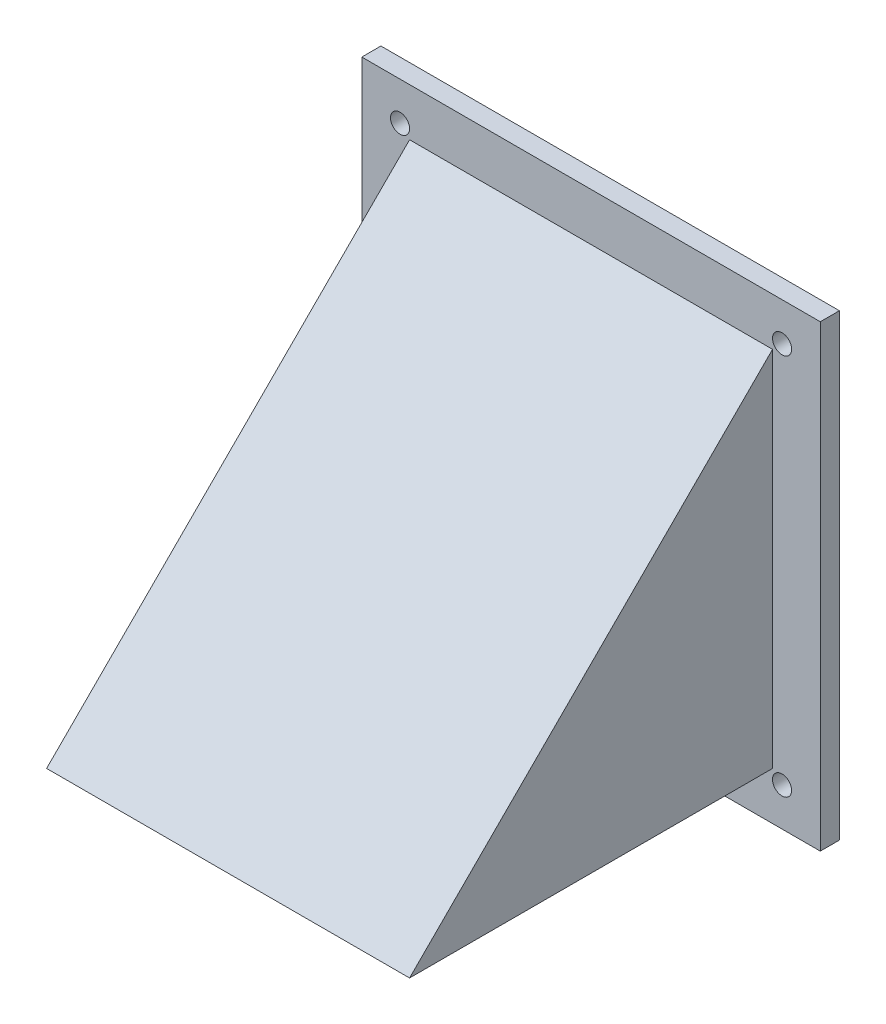
ISO-10303-21;
HEADER;
FILE_DESCRIPTION(('STEP AP214'),'2;1');
FILE_NAME('part.step','',(''),(''),'','','');
FILE_SCHEMA(('AUTOMOTIVE_DESIGN { 1 0 10303 214 1 1 1 1 }'));
ENDSEC;
DATA;
#1=APPLICATION_CONTEXT('core data for automotive mechanical design processes');
#2=APPLICATION_PROTOCOL_DEFINITION('international standard','automotive_design',2000,#1);
#3=PRODUCT_CONTEXT('',#1,'mechanical');
#4=PRODUCT('Part','Part','',(#3));
#5=PRODUCT_RELATED_PRODUCT_CATEGORY('part','',(#4));
#6=PRODUCT_DEFINITION_FORMATION('','',#4);
#7=PRODUCT_DEFINITION_CONTEXT('part definition',#1,'design');
#8=PRODUCT_DEFINITION('design','',#6,#7);
#9=PRODUCT_DEFINITION_SHAPE('','',#8);
#10=(LENGTH_UNIT() NAMED_UNIT(*) SI_UNIT(.MILLI.,.METRE.));
#11=(NAMED_UNIT(*) PLANE_ANGLE_UNIT() SI_UNIT($,.RADIAN.));
#12=(NAMED_UNIT(*) SI_UNIT($,.STERADIAN.) SOLID_ANGLE_UNIT());
#13=UNCERTAINTY_MEASURE_WITH_UNIT(LENGTH_MEASURE(1.E-05),#10,'distance_accuracy_value','');
#14=(GEOMETRIC_REPRESENTATION_CONTEXT(3) GLOBAL_UNCERTAINTY_ASSIGNED_CONTEXT((#13)) GLOBAL_UNIT_ASSIGNED_CONTEXT((#10,
#11,#12)) REPRESENTATION_CONTEXT('',''));
#15=CARTESIAN_POINT('',(0.,0.,0.));
#16=DIRECTION('',(0.,0.,1.));
#17=DIRECTION('',(1.,0.,0.));
#18=AXIS2_PLACEMENT_3D('',#15,#16,#17);
#19=CARTESIAN_POINT('',(0.,0.,5.));
#20=DIRECTION('',(0.,0.,1.));
#21=DIRECTION('',(1.,0.,0.));
#22=AXIS2_PLACEMENT_3D('',#19,#20,#21);
#23=PLANE('',#22);
#24=CARTESIAN_POINT('',(109.98895260226,-110.,5.));
#25=DIRECTION('',(0.,0.,1.));
#26=DIRECTION('',(1.,0.,0.));
#27=AXIS2_PLACEMENT_3D('',#24,#25,#26);
#28=CIRCLE('',#27,2.50000000000001);
#29=CARTESIAN_POINT('',(112.48895260226,-110.,5.));
#30=VERTEX_POINT('',#29);
#31=EDGE_CURVE('E195',#30,#30,#28,.T.);
#32=ORIENTED_EDGE('',*,*,#31,.F.);
#33=EDGE_LOOP('',(#32));
#34=FACE_BOUND('',#33,.T.);
#35=CARTESIAN_POINT('',(110.,-9.99999999999999,5.));
#36=DIRECTION('',(0.,0.,1.));
#37=DIRECTION('',(1.,0.,0.));
#38=AXIS2_PLACEMENT_3D('',#35,#36,#37);
#39=CIRCLE('',#38,2.49999999999999);
#40=CARTESIAN_POINT('',(112.5,-9.99999999999999,5.));
#41=VERTEX_POINT('',#40);
#42=EDGE_CURVE('E211',#41,#41,#39,.T.);
#43=ORIENTED_EDGE('',*,*,#42,.F.);
#44=EDGE_LOOP('',(#43));
#45=FACE_BOUND('',#44,.T.);
#46=DIRECTION('',(0.,-1.,0.));
#47=VECTOR('',#46,1.);
#48=CARTESIAN_POINT('',(0.,0.,5.));
#49=LINE('',#48,#47);
#50=CARTESIAN_POINT('',(0.,0.,5.));
#51=VERTEX_POINT('',#50);
#52=CARTESIAN_POINT('',(0.,-120.,5.));
#53=VERTEX_POINT('',#52);
#54=EDGE_CURVE('E227',#51,#53,#49,.T.);
#55=ORIENTED_EDGE('',*,*,#54,.T.);
#56=DIRECTION('',(1.,0.,0.));
#57=VECTOR('',#56,1.);
#58=CARTESIAN_POINT('',(0.,-120.,5.));
#59=LINE('',#58,#57);
#60=CARTESIAN_POINT('',(120.,-120.,5.));
#61=VERTEX_POINT('',#60);
#62=EDGE_CURVE('E231',#53,#61,#59,.T.);
#63=ORIENTED_EDGE('',*,*,#62,.T.);
#64=DIRECTION('',(0.,1.,0.));
#65=VECTOR('',#64,1.);
#66=CARTESIAN_POINT('',(120.,0.,5.));
#67=LINE('',#66,#65);
#68=CARTESIAN_POINT('',(120.,0.,5.));
#69=VERTEX_POINT('',#68);
#70=EDGE_CURVE('E235',#61,#69,#67,.T.);
#71=ORIENTED_EDGE('',*,*,#70,.T.);
#72=DIRECTION('',(-1.,0.,0.));
#73=VECTOR('',#72,1.);
#74=CARTESIAN_POINT('',(0.,0.,5.));
#75=LINE('',#74,#73);
#76=EDGE_CURVE('E238',#69,#51,#75,.T.);
#77=ORIENTED_EDGE('',*,*,#76,.T.);
#78=EDGE_LOOP('',(#55,#63,#71,#77));
#79=FACE_BOUND('',#78,.T.);
#80=CARTESIAN_POINT('',(9.99999999999999,-10.000000610225,5.));
#81=DIRECTION('',(0.,0.,1.));
#82=DIRECTION('',(1.,0.,0.));
#83=AXIS2_PLACEMENT_3D('',#80,#81,#82);
#84=CIRCLE('',#83,2.5);
#85=CARTESIAN_POINT('',(12.5,-10.000000610225,5.));
#86=VERTEX_POINT('',#85);
#87=EDGE_CURVE('E219',#86,#86,#84,.T.);
#88=ORIENTED_EDGE('',*,*,#87,.F.);
#89=EDGE_LOOP('',(#88));
#90=FACE_BOUND('',#89,.T.);
#91=CARTESIAN_POINT('',(9.98895260226039,-110.,5.));
#92=DIRECTION('',(0.,0.,1.));
#93=DIRECTION('',(1.,0.,0.));
#94=AXIS2_PLACEMENT_3D('',#91,#92,#93);
#95=CIRCLE('',#94,2.5);
#96=CARTESIAN_POINT('',(12.4889526022604,-110.,5.));
#97=VERTEX_POINT('',#96);
#98=EDGE_CURVE('E203',#97,#97,#95,.T.);
#99=ORIENTED_EDGE('',*,*,#98,.F.);
#100=EDGE_LOOP('',(#99));
#101=FACE_BOUND('',#100,.T.);
#102=DIRECTION('',(0.,-1.,0.));
#103=VECTOR('',#102,1.);
#104=CARTESIAN_POINT('',(12.5,-12.5,5.));
#105=LINE('',#104,#103);
#106=CARTESIAN_POINT('',(12.5,-12.5,5.));
#107=VERTEX_POINT('',#106);
#108=CARTESIAN_POINT('',(12.5,-107.5,5.));
#109=VERTEX_POINT('',#108);
#110=EDGE_CURVE('E324',#107,#109,#105,.T.);
#111=ORIENTED_EDGE('',*,*,#110,.F.);
#112=DIRECTION('',(-1.,0.,0.));
#113=VECTOR('',#112,1.);
#114=CARTESIAN_POINT('',(107.5,-12.5,5.));
#115=LINE('',#114,#113);
#116=CARTESIAN_POINT('',(107.5,-12.5,5.));
#117=VERTEX_POINT('',#116);
#118=EDGE_CURVE('E326',#117,#107,#115,.T.);
#119=ORIENTED_EDGE('',*,*,#118,.F.);
#120=DIRECTION('',(0.,1.,0.));
#121=VECTOR('',#120,1.);
#122=CARTESIAN_POINT('',(107.5,-107.5,5.));
#123=LINE('',#122,#121);
#124=CARTESIAN_POINT('',(107.5,-107.5,5.));
#125=VERTEX_POINT('',#124);
#126=EDGE_CURVE('E336',#125,#117,#123,.T.);
#127=ORIENTED_EDGE('',*,*,#126,.F.);
#128=DIRECTION('',(1.,0.,0.));
#129=VECTOR('',#128,1.);
#130=CARTESIAN_POINT('',(12.5,-107.5,5.));
#131=LINE('',#130,#129);
#132=EDGE_CURVE('E327',#109,#125,#131,.T.);
#133=ORIENTED_EDGE('',*,*,#132,.F.);
#134=EDGE_LOOP('',(#111,#119,#127,#133));
#135=FACE_BOUND('',#134,.T.);
#136=ADVANCED_FACE('F41',(#34,#45,#79,#90,#101,#135),#23,.T.);
#137=CARTESIAN_POINT('',(0.,0.,0.));
#138=DIRECTION('',(0.,0.,1.));
#139=DIRECTION('',(1.,0.,0.));
#140=AXIS2_PLACEMENT_3D('',#137,#138,#139);
#141=PLANE('',#140);
#142=CARTESIAN_POINT('',(109.98895260226,-110.,0.));
#143=DIRECTION('',(0.,0.,1.));
#144=DIRECTION('',(1.,0.,0.));
#145=AXIS2_PLACEMENT_3D('',#142,#143,#144);
#146=CIRCLE('',#145,2.50000000000001);
#147=CARTESIAN_POINT('',(112.48895260226,-110.,0.));
#148=VERTEX_POINT('',#147);
#149=EDGE_CURVE('E194',#148,#148,#146,.T.);
#150=ORIENTED_EDGE('',*,*,#149,.T.);
#151=EDGE_LOOP('',(#150));
#152=FACE_BOUND('',#151,.T.);
#153=CARTESIAN_POINT('',(9.98895260226039,-110.,0.));
#154=DIRECTION('',(0.,0.,1.));
#155=DIRECTION('',(1.,0.,0.));
#156=AXIS2_PLACEMENT_3D('',#153,#154,#155);
#157=CIRCLE('',#156,2.5);
#158=CARTESIAN_POINT('',(12.4889526022604,-110.,0.));
#159=VERTEX_POINT('',#158);
#160=EDGE_CURVE('E199',#159,#159,#157,.T.);
#161=ORIENTED_EDGE('',*,*,#160,.T.);
#162=EDGE_LOOP('',(#161));
#163=FACE_BOUND('',#162,.T.);
#164=CARTESIAN_POINT('',(110.,-9.99999999999999,0.));
#165=DIRECTION('',(0.,0.,1.));
#166=DIRECTION('',(1.,0.,0.));
#167=AXIS2_PLACEMENT_3D('',#164,#165,#166);
#168=CIRCLE('',#167,2.49999999999999);
#169=CARTESIAN_POINT('',(112.5,-9.99999999999999,0.));
#170=VERTEX_POINT('',#169);
#171=EDGE_CURVE('E207',#170,#170,#168,.T.);
#172=ORIENTED_EDGE('',*,*,#171,.T.);
#173=EDGE_LOOP('',(#172));
#174=FACE_BOUND('',#173,.T.);
#175=CARTESIAN_POINT('',(9.99999999999999,-10.000000610225,0.));
#176=DIRECTION('',(0.,0.,1.));
#177=DIRECTION('',(1.,0.,0.));
#178=AXIS2_PLACEMENT_3D('',#175,#176,#177);
#179=CIRCLE('',#178,2.5);
#180=CARTESIAN_POINT('',(12.5,-10.000000610225,0.));
#181=VERTEX_POINT('',#180);
#182=EDGE_CURVE('E215',#181,#181,#179,.T.);
#183=ORIENTED_EDGE('',*,*,#182,.T.);
#184=EDGE_LOOP('',(#183));
#185=FACE_BOUND('',#184,.T.);
#186=DIRECTION('',(0.,-1.,0.));
#187=VECTOR('',#186,1.);
#188=CARTESIAN_POINT('',(0.,0.,0.));
#189=LINE('',#188,#187);
#190=CARTESIAN_POINT('',(0.,0.,0.));
#191=VERTEX_POINT('',#190);
#192=CARTESIAN_POINT('',(0.,-120.,0.));
#193=VERTEX_POINT('',#192);
#194=EDGE_CURVE('E223',#191,#193,#189,.T.);
#195=ORIENTED_EDGE('',*,*,#194,.F.);
#196=DIRECTION('',(-1.,0.,0.));
#197=VECTOR('',#196,1.);
#198=CARTESIAN_POINT('',(0.,0.,0.));
#199=LINE('',#198,#197);
#200=CARTESIAN_POINT('',(120.,0.,0.));
#201=VERTEX_POINT('',#200);
#202=EDGE_CURVE('E232',#201,#191,#199,.T.);
#203=ORIENTED_EDGE('',*,*,#202,.F.);
#204=DIRECTION('',(0.,1.,0.));
#205=VECTOR('',#204,1.);
#206=CARTESIAN_POINT('',(120.,0.,0.));
#207=LINE('',#206,#205);
#208=CARTESIAN_POINT('',(120.,-120.,0.));
#209=VERTEX_POINT('',#208);
#210=EDGE_CURVE('E248',#209,#201,#207,.T.);
#211=ORIENTED_EDGE('',*,*,#210,.F.);
#212=DIRECTION('',(1.,0.,0.));
#213=VECTOR('',#212,1.);
#214=CARTESIAN_POINT('',(0.,-120.,0.));
#215=LINE('',#214,#213);
#216=EDGE_CURVE('E245',#193,#209,#215,.T.);
#217=ORIENTED_EDGE('',*,*,#216,.F.);
#218=EDGE_LOOP('',(#195,#203,#211,#217));
#219=FACE_BOUND('',#218,.T.);
#220=DIRECTION('',(0.,-1.,0.));
#221=VECTOR('',#220,1.);
#222=CARTESIAN_POINT('',(16.25,-16.25,0.));
#223=LINE('',#222,#221);
#224=CARTESIAN_POINT('',(16.25,-16.25,0.));
#225=VERTEX_POINT('',#224);
#226=CARTESIAN_POINT('',(16.25,-103.75,0.));
#227=VERTEX_POINT('',#226);
#228=EDGE_CURVE('E180',#225,#227,#223,.T.);
#229=ORIENTED_EDGE('',*,*,#228,.T.);
#230=DIRECTION('',(1.,0.,0.));
#231=VECTOR('',#230,1.);
#232=CARTESIAN_POINT('',(16.25,-103.75,0.));
#233=LINE('',#232,#231);
#234=CARTESIAN_POINT('',(103.75,-103.75,0.));
#235=VERTEX_POINT('',#234);
#236=EDGE_CURVE('E352',#227,#235,#233,.T.);
#237=ORIENTED_EDGE('',*,*,#236,.T.);
#238=DIRECTION('',(0.,1.,0.));
#239=VECTOR('',#238,1.);
#240=CARTESIAN_POINT('',(103.75,-16.25,0.));
#241=LINE('',#240,#239);
#242=CARTESIAN_POINT('',(103.75,-16.25,0.));
#243=VERTEX_POINT('',#242);
#244=EDGE_CURVE('E355',#235,#243,#241,.T.);
#245=ORIENTED_EDGE('',*,*,#244,.T.);
#246=DIRECTION('',(-1.,0.,0.));
#247=VECTOR('',#246,1.);
#248=CARTESIAN_POINT('',(16.25,-16.25,0.));
#249=LINE('',#248,#247);
#250=EDGE_CURVE('E175',#243,#225,#249,.T.);
#251=ORIENTED_EDGE('',*,*,#250,.T.);
#252=EDGE_LOOP('',(#229,#237,#245,#251));
#253=FACE_BOUND('',#252,.T.);
#254=ADVANCED_FACE('F271',(#152,#163,#174,#185,#219,#253),#141,.F.);
#255=CARTESIAN_POINT('',(0.,0.,5.));
#256=DIRECTION('',(1.,0.,0.));
#257=DIRECTION('',(0.,1.,0.));
#258=AXIS2_PLACEMENT_3D('',#255,#256,#257);
#259=PLANE('',#258);
#260=ORIENTED_EDGE('',*,*,#194,.T.);
#261=DIRECTION('',(0.,0.,-1.));
#262=VECTOR('',#261,1.);
#263=CARTESIAN_POINT('',(0.,-120.,5.));
#264=LINE('',#263,#262);
#265=EDGE_CURVE('E12',#53,#193,#264,.T.);
#266=ORIENTED_EDGE('',*,*,#265,.F.);
#267=ORIENTED_EDGE('',*,*,#54,.F.);
#268=DIRECTION('',(0.,0.,-1.));
#269=VECTOR('',#268,1.);
#270=CARTESIAN_POINT('',(0.,0.,5.));
#271=LINE('',#270,#269);
#272=EDGE_CURVE('E241',#51,#191,#271,.T.);
#273=ORIENTED_EDGE('',*,*,#272,.T.);
#274=EDGE_LOOP('',(#260,#266,#267,#273));
#275=FACE_BOUND('',#274,.T.);
#276=ADVANCED_FACE('F43',(#275),#259,.F.);
#277=CARTESIAN_POINT('',(0.,-120.,5.));
#278=DIRECTION('',(0.,1.,0.));
#279=DIRECTION('',(0.,0.,1.));
#280=AXIS2_PLACEMENT_3D('',#277,#278,#279);
#281=PLANE('',#280);
#282=ORIENTED_EDGE('',*,*,#216,.T.);
#283=DIRECTION('',(0.,0.,-1.));
#284=VECTOR('',#283,1.);
#285=CARTESIAN_POINT('',(120.,-120.,5.));
#286=LINE('',#285,#284);
#287=EDGE_CURVE('E50',#61,#209,#286,.T.);
#288=ORIENTED_EDGE('',*,*,#287,.F.);
#289=ORIENTED_EDGE('',*,*,#62,.F.);
#290=ORIENTED_EDGE('',*,*,#265,.T.);
#291=EDGE_LOOP('',(#282,#288,#289,#290));
#292=FACE_BOUND('',#291,.T.);
#293=ADVANCED_FACE('F282',(#292),#281,.F.);
#294=CARTESIAN_POINT('',(120.,0.,5.));
#295=DIRECTION('',(-1.,0.,0.));
#296=DIRECTION('',(0.,-1.,0.));
#297=AXIS2_PLACEMENT_3D('',#294,#295,#296);
#298=PLANE('',#297);
#299=ORIENTED_EDGE('',*,*,#210,.T.);
#300=DIRECTION('',(0.,0.,-1.));
#301=VECTOR('',#300,1.);
#302=CARTESIAN_POINT('',(120.,0.,5.));
#303=LINE('',#302,#301);
#304=EDGE_CURVE('E256',#69,#201,#303,.T.);
#305=ORIENTED_EDGE('',*,*,#304,.F.);
#306=ORIENTED_EDGE('',*,*,#70,.F.);
#307=ORIENTED_EDGE('',*,*,#287,.T.);
#308=EDGE_LOOP('',(#299,#305,#306,#307));
#309=FACE_BOUND('',#308,.T.);
#310=ADVANCED_FACE('F265',(#309),#298,.F.);
#311=CARTESIAN_POINT('',(0.,0.,5.));
#312=DIRECTION('',(0.,-1.,0.));
#313=DIRECTION('',(0.,0.,-1.));
#314=AXIS2_PLACEMENT_3D('',#311,#312,#313);
#315=PLANE('',#314);
#316=ORIENTED_EDGE('',*,*,#202,.T.);
#317=ORIENTED_EDGE('',*,*,#272,.F.);
#318=ORIENTED_EDGE('',*,*,#76,.F.);
#319=ORIENTED_EDGE('',*,*,#304,.T.);
#320=EDGE_LOOP('',(#316,#317,#318,#319));
#321=FACE_BOUND('',#320,.T.);
#322=ADVANCED_FACE('F275',(#321),#315,.F.);
#323=CARTESIAN_POINT('',(9.99999999999999,-10.000000610225,5.));
#324=DIRECTION('',(0.,0.,-1.));
#325=DIRECTION('',(-1.,0.,0.));
#326=AXIS2_PLACEMENT_3D('',#323,#324,#325);
#327=CYLINDRICAL_SURFACE('',#326,2.5);
#328=ORIENTED_EDGE('',*,*,#87,.T.);
#329=EDGE_LOOP('',(#328));
#330=FACE_BOUND('',#329,.T.);
#331=ORIENTED_EDGE('',*,*,#182,.F.);
#332=EDGE_LOOP('',(#331));
#333=FACE_BOUND('',#332,.T.);
#334=ADVANCED_FACE('F300',(#330,#333),#327,.F.);
#335=CARTESIAN_POINT('',(110.,-9.99999999999999,5.));
#336=DIRECTION('',(0.,0.,-1.));
#337=DIRECTION('',(-1.,0.,0.));
#338=AXIS2_PLACEMENT_3D('',#335,#336,#337);
#339=CYLINDRICAL_SURFACE('',#338,2.49999999999999);
#340=ORIENTED_EDGE('',*,*,#42,.T.);
#341=EDGE_LOOP('',(#340));
#342=FACE_BOUND('',#341,.T.);
#343=ORIENTED_EDGE('',*,*,#171,.F.);
#344=EDGE_LOOP('',(#343));
#345=FACE_BOUND('',#344,.T.);
#346=ADVANCED_FACE('F307',(#342,#345),#339,.F.);
#347=CARTESIAN_POINT('',(9.98895260226039,-110.,5.));
#348=DIRECTION('',(0.,0.,-1.));
#349=DIRECTION('',(-1.,0.,0.));
#350=AXIS2_PLACEMENT_3D('',#347,#348,#349);
#351=CYLINDRICAL_SURFACE('',#350,2.5);
#352=ORIENTED_EDGE('',*,*,#98,.T.);
#353=EDGE_LOOP('',(#352));
#354=FACE_BOUND('',#353,.T.);
#355=ORIENTED_EDGE('',*,*,#160,.F.);
#356=EDGE_LOOP('',(#355));
#357=FACE_BOUND('',#356,.T.);
#358=ADVANCED_FACE('F312',(#354,#357),#351,.F.);
#359=CARTESIAN_POINT('',(109.98895260226,-110.,5.));
#360=DIRECTION('',(0.,0.,-1.));
#361=DIRECTION('',(-1.,0.,0.));
#362=AXIS2_PLACEMENT_3D('',#359,#360,#361);
#363=CYLINDRICAL_SURFACE('',#362,2.50000000000001);
#364=ORIENTED_EDGE('',*,*,#31,.T.);
#365=EDGE_LOOP('',(#364));
#366=FACE_BOUND('',#365,.T.);
#367=ORIENTED_EDGE('',*,*,#149,.F.);
#368=EDGE_LOOP('',(#367));
#369=FACE_BOUND('',#368,.T.);
#370=ADVANCED_FACE('F413',(#366,#369),#363,.F.);
#371=CARTESIAN_POINT('',(16.25,-16.25,5.));
#372=DIRECTION('',(1.,0.,0.));
#373=DIRECTION('',(0.,1.,0.));
#374=AXIS2_PLACEMENT_3D('',#371,#372,#373);
#375=PLANE('',#374);
#376=ORIENTED_EDGE('',*,*,#228,.F.);
#377=DIRECTION('',(0.,0.,-1.));
#378=VECTOR('',#377,1.);
#379=CARTESIAN_POINT('',(16.25,-16.25,5.));
#380=LINE('',#379,#378);
#381=CARTESIAN_POINT('',(16.25,-16.25,5.));
#382=VERTEX_POINT('',#381);
#383=EDGE_CURVE('E171',#382,#225,#380,.T.);
#384=ORIENTED_EDGE('',*,*,#383,.F.);
#385=DIRECTION('',(0.,0.685994340570036,-0.727606875108998));
#386=VECTOR('',#385,1.);
#387=CARTESIAN_POINT('',(16.25,-16.25,5.));
#388=LINE('',#387,#386);
#389=CARTESIAN_POINT('',(16.25,-19.7855339059328,8.75000000000001));
#390=VERTEX_POINT('',#389);
#391=EDGE_CURVE('E152',#390,#382,#388,.T.);
#392=ORIENTED_EDGE('',*,*,#391,.F.);
#393=DIRECTION('',(0.,-0.707106781186548,0.707106781186548));
#394=VECTOR('',#393,1.);
#395=CARTESIAN_POINT('',(16.25,-9.47461222902128,-1.56092167691144));
#396=LINE('',#395,#394);
#397=CARTESIAN_POINT('',(16.25,-107.285533905933,96.25));
#398=VERTEX_POINT('',#397);
#399=EDGE_CURVE('E382',#390,#398,#396,.T.);
#400=ORIENTED_EDGE('',*,*,#399,.T.);
#401=DIRECTION('',(0.,-1.,0.));
#402=VECTOR('',#401,1.);
#403=CARTESIAN_POINT('',(16.25,88.3363094478902,96.25));
#404=LINE('',#403,#402);
#405=CARTESIAN_POINT('',(16.25,-107.5,96.25));
#406=VERTEX_POINT('',#405);
#407=EDGE_CURVE('E601',#398,#406,#404,.T.);
#408=ORIENTED_EDGE('',*,*,#407,.T.);
#409=DIRECTION('',(0.,0.,-1.));
#410=VECTOR('',#409,1.);
#411=CARTESIAN_POINT('',(16.25,-107.5,96.25));
#412=LINE('',#411,#410);
#413=CARTESIAN_POINT('',(16.25,-107.5,8.75000000000001));
#414=VERTEX_POINT('',#413);
#415=EDGE_CURVE('E364',#406,#414,#412,.T.);
#416=ORIENTED_EDGE('',*,*,#415,.T.);
#417=DIRECTION('',(0.,-1.,0.));
#418=VECTOR('',#417,1.);
#419=CARTESIAN_POINT('',(16.25,88.3363094478902,8.75000000000001));
#420=LINE('',#419,#418);
#421=CARTESIAN_POINT('',(16.25,-103.75,8.75000000000001));
#422=VERTEX_POINT('',#421);
#423=EDGE_CURVE('E57',#422,#414,#420,.T.);
#424=ORIENTED_EDGE('',*,*,#423,.F.);
#425=DIRECTION('',(0.,0.,-1.));
#426=VECTOR('',#425,1.);
#427=CARTESIAN_POINT('',(16.25,-103.75,5.));
#428=LINE('',#427,#426);
#429=EDGE_CURVE('E191',#422,#227,#428,.T.);
#430=ORIENTED_EDGE('',*,*,#429,.T.);
#431=EDGE_LOOP('',(#376,#384,#392,#400,#408,#416,#424,#430));
#432=FACE_BOUND('',#431,.T.);
#433=ADVANCED_FACE('F177',(#432),#375,.T.);
#434=CARTESIAN_POINT('',(16.25,-103.75,5.));
#435=DIRECTION('',(0.,1.,0.));
#436=DIRECTION('',(0.,0.,1.));
#437=AXIS2_PLACEMENT_3D('',#434,#435,#436);
#438=PLANE('',#437);
#439=ORIENTED_EDGE('',*,*,#236,.F.);
#440=ORIENTED_EDGE('',*,*,#429,.F.);
#441=DIRECTION('',(1.,0.,0.));
#442=VECTOR('',#441,1.);
#443=CARTESIAN_POINT('',(103.75,-103.75,8.75000000000001));
#444=LINE('',#443,#442);
#445=CARTESIAN_POINT('',(103.75,-103.75,8.75000000000001));
#446=VERTEX_POINT('',#445);
#447=EDGE_CURVE('E163',#422,#446,#444,.T.);
#448=ORIENTED_EDGE('',*,*,#447,.T.);
#449=DIRECTION('',(0.,0.,-1.));
#450=VECTOR('',#449,1.);
#451=CARTESIAN_POINT('',(103.75,-103.75,5.));
#452=LINE('',#451,#450);
#453=EDGE_CURVE('E184',#446,#235,#452,.T.);
#454=ORIENTED_EDGE('',*,*,#453,.T.);
#455=EDGE_LOOP('',(#439,#440,#448,#454));
#456=FACE_BOUND('',#455,.T.);
#457=ADVANCED_FACE('F361',(#456),#438,.T.);
#458=CARTESIAN_POINT('',(103.75,-16.25,5.));
#459=DIRECTION('',(-1.,0.,0.));
#460=DIRECTION('',(0.,-1.,0.));
#461=AXIS2_PLACEMENT_3D('',#458,#459,#460);
#462=PLANE('',#461);
#463=DIRECTION('',(0.,0.685994340570036,-0.727606875108998));
#464=VECTOR('',#463,1.);
#465=CARTESIAN_POINT('',(103.75,-16.25,5.));
#466=LINE('',#465,#464);
#467=CARTESIAN_POINT('',(103.75,-19.7855339059328,8.75000000000001));
#468=VERTEX_POINT('',#467);
#469=CARTESIAN_POINT('',(103.75,-16.25,5.));
#470=VERTEX_POINT('',#469);
#471=EDGE_CURVE('E164',#468,#470,#466,.T.);
#472=ORIENTED_EDGE('',*,*,#471,.T.);
#473=DIRECTION('',(0.,0.,-1.));
#474=VECTOR('',#473,1.);
#475=CARTESIAN_POINT('',(103.75,-16.25,5.));
#476=LINE('',#475,#474);
#477=EDGE_CURVE('E173',#470,#243,#476,.T.);
#478=ORIENTED_EDGE('',*,*,#477,.T.);
#479=ORIENTED_EDGE('',*,*,#244,.F.);
#480=ORIENTED_EDGE('',*,*,#453,.F.);
#481=DIRECTION('',(0.,-1.,0.));
#482=VECTOR('',#481,1.);
#483=CARTESIAN_POINT('',(103.75,88.3363094478902,8.75000000000001));
#484=LINE('',#483,#482);
#485=CARTESIAN_POINT('',(103.75,-107.5,8.75000000000001));
#486=VERTEX_POINT('',#485);
#487=EDGE_CURVE('E367',#446,#486,#484,.T.);
#488=ORIENTED_EDGE('',*,*,#487,.T.);
#489=DIRECTION('',(0.,0.,1.));
#490=VECTOR('',#489,1.);
#491=CARTESIAN_POINT('',(103.75,-107.5,96.25));
#492=LINE('',#491,#490);
#493=CARTESIAN_POINT('',(103.75,-107.5,96.25));
#494=VERTEX_POINT('',#493);
#495=EDGE_CURVE('E375',#486,#494,#492,.T.);
#496=ORIENTED_EDGE('',*,*,#495,.T.);
#497=DIRECTION('',(0.,-1.,0.));
#498=VECTOR('',#497,1.);
#499=CARTESIAN_POINT('',(103.75,88.3363094478902,96.25));
#500=LINE('',#499,#498);
#501=CARTESIAN_POINT('',(103.75,-107.285533905933,96.25));
#502=VERTEX_POINT('',#501);
#503=EDGE_CURVE('E372',#502,#494,#500,.T.);
#504=ORIENTED_EDGE('',*,*,#503,.F.);
#505=DIRECTION('',(0.,0.707106781186548,-0.707106781186548));
#506=VECTOR('',#505,1.);
#507=CARTESIAN_POINT('',(103.75,-9.47461222902128,-1.56092167691144));
#508=LINE('',#507,#506);
#509=EDGE_CURVE('E596',#502,#468,#508,.T.);
#510=ORIENTED_EDGE('',*,*,#509,.T.);
#511=EDGE_LOOP('',(#472,#478,#479,#480,#488,#496,#504,#510));
#512=FACE_BOUND('',#511,.T.);
#513=ADVANCED_FACE('F402',(#512),#462,.T.);
#514=CARTESIAN_POINT('',(16.25,-16.25,5.));
#515=DIRECTION('',(0.,-1.,0.));
#516=DIRECTION('',(0.,0.,-1.));
#517=AXIS2_PLACEMENT_3D('',#514,#515,#516);
#518=PLANE('',#517);
#519=ORIENTED_EDGE('',*,*,#250,.F.);
#520=ORIENTED_EDGE('',*,*,#477,.F.);
#521=DIRECTION('',(-1.,0.,0.));
#522=VECTOR('',#521,1.);
#523=CARTESIAN_POINT('',(16.25,-16.25,5.));
#524=LINE('',#523,#522);
#525=EDGE_CURVE('E155',#470,#382,#524,.T.);
#526=ORIENTED_EDGE('',*,*,#525,.T.);
#527=ORIENTED_EDGE('',*,*,#383,.T.);
#528=EDGE_LOOP('',(#519,#520,#526,#527));
#529=FACE_BOUND('',#528,.T.);
#530=ADVANCED_FACE('F170',(#529),#518,.T.);
#531=CARTESIAN_POINT('',(12.5,-12.5,100.));
#532=DIRECTION('',(1.,0.,0.));
#533=DIRECTION('',(0.,1.,0.));
#534=AXIS2_PLACEMENT_3D('',#531,#532,#533);
#535=PLANE('',#534);
#536=DIRECTION('',(0.,0.,-1.));
#537=VECTOR('',#536,1.);
#538=CARTESIAN_POINT('',(12.5,-107.5,100.));
#539=LINE('',#538,#537);
#540=CARTESIAN_POINT('',(12.5,-107.5,100.));
#541=VERTEX_POINT('',#540);
#542=EDGE_CURVE('E347',#541,#109,#539,.T.);
#543=ORIENTED_EDGE('',*,*,#542,.F.);
#544=DIRECTION('',(0.,0.707106781186548,-0.707106781186548));
#545=VECTOR('',#544,1.);
#546=CARTESIAN_POINT('',(12.5,-12.5,5.));
#547=LINE('',#546,#545);
#548=EDGE_CURVE('E338',#541,#107,#547,.T.);
#549=ORIENTED_EDGE('',*,*,#548,.T.);
#550=ORIENTED_EDGE('',*,*,#110,.T.);
#551=EDGE_LOOP('',(#543,#549,#550));
#552=FACE_BOUND('',#551,.T.);
#553=ADVANCED_FACE('F393',(#552),#535,.F.);
#554=CARTESIAN_POINT('',(12.5,-107.5,100.));
#555=DIRECTION('',(0.,1.,0.));
#556=DIRECTION('',(0.,0.,1.));
#557=AXIS2_PLACEMENT_3D('',#554,#555,#556);
#558=PLANE('',#557);
#559=DIRECTION('',(1.,0.,0.));
#560=VECTOR('',#559,1.);
#561=CARTESIAN_POINT('',(16.25,-107.5,8.75000000000001));
#562=LINE('',#561,#560);
#563=EDGE_CURVE('E585',#414,#486,#562,.T.);
#564=ORIENTED_EDGE('',*,*,#563,.F.);
#565=ORIENTED_EDGE('',*,*,#415,.F.);
#566=DIRECTION('',(-1.,0.,0.));
#567=VECTOR('',#566,1.);
#568=CARTESIAN_POINT('',(16.25,-107.5,96.25));
#569=LINE('',#568,#567);
#570=EDGE_CURVE('E368',#494,#406,#569,.T.);
#571=ORIENTED_EDGE('',*,*,#570,.F.);
#572=ORIENTED_EDGE('',*,*,#495,.F.);
#573=EDGE_LOOP('',(#564,#565,#571,#572));
#574=FACE_BOUND('',#573,.T.);
#575=ORIENTED_EDGE('',*,*,#132,.T.);
#576=DIRECTION('',(0.,0.,-1.));
#577=VECTOR('',#576,1.);
#578=CARTESIAN_POINT('',(107.5,-107.5,100.));
#579=LINE('',#578,#577);
#580=CARTESIAN_POINT('',(107.5,-107.5,100.));
#581=VERTEX_POINT('',#580);
#582=EDGE_CURVE('E65',#581,#125,#579,.T.);
#583=ORIENTED_EDGE('',*,*,#582,.F.);
#584=DIRECTION('',(1.,0.,0.));
#585=VECTOR('',#584,1.);
#586=CARTESIAN_POINT('',(12.5,-107.5,100.));
#587=LINE('',#586,#585);
#588=EDGE_CURVE('E344',#541,#581,#587,.T.);
#589=ORIENTED_EDGE('',*,*,#588,.F.);
#590=ORIENTED_EDGE('',*,*,#542,.T.);
#591=EDGE_LOOP('',(#575,#583,#589,#590));
#592=FACE_BOUND('',#591,.T.);
#593=ADVANCED_FACE('F392',(#574,#592),#558,.F.);
#594=CARTESIAN_POINT('',(107.5,-107.5,100.));
#595=DIRECTION('',(-1.,0.,0.));
#596=DIRECTION('',(0.,-1.,0.));
#597=AXIS2_PLACEMENT_3D('',#594,#595,#596);
#598=PLANE('',#597);
#599=ORIENTED_EDGE('',*,*,#126,.T.);
#600=DIRECTION('',(0.,0.707106781186548,-0.707106781186548));
#601=VECTOR('',#600,1.);
#602=CARTESIAN_POINT('',(107.5,-12.5,5.));
#603=LINE('',#602,#601);
#604=EDGE_CURVE('E381',#581,#117,#603,.T.);
#605=ORIENTED_EDGE('',*,*,#604,.F.);
#606=ORIENTED_EDGE('',*,*,#582,.T.);
#607=EDGE_LOOP('',(#599,#605,#606));
#608=FACE_BOUND('',#607,.T.);
#609=ADVANCED_FACE('F391',(#608),#598,.F.);
#610=CARTESIAN_POINT('',(12.5,-12.5,5.));
#611=DIRECTION('',(0.,-0.707106781186548,-0.707106781186548));
#612=DIRECTION('',(0.,0.707106781186548,-0.707106781186548));
#613=AXIS2_PLACEMENT_3D('',#610,#611,#612);
#614=PLANE('',#613);
#615=ORIENTED_EDGE('',*,*,#604,.T.);
#616=ORIENTED_EDGE('',*,*,#118,.T.);
#617=ORIENTED_EDGE('',*,*,#548,.F.);
#618=ORIENTED_EDGE('',*,*,#588,.T.);
#619=EDGE_LOOP('',(#615,#616,#617,#618));
#620=FACE_BOUND('',#619,.T.);
#621=ADVANCED_FACE('F389',(#620),#614,.F.);
#622=CARTESIAN_POINT('',(16.25,88.3363094478902,96.25));
#623=DIRECTION('',(0.,0.,1.));
#624=DIRECTION('',(1.,0.,0.));
#625=AXIS2_PLACEMENT_3D('',#622,#623,#624);
#626=PLANE('',#625);
#627=DIRECTION('',(1.,0.,0.));
#628=VECTOR('',#627,1.);
#629=CARTESIAN_POINT('',(16.25,-107.285533905933,96.25));
#630=LINE('',#629,#628);
#631=EDGE_CURVE('E600',#398,#502,#630,.T.);
#632=ORIENTED_EDGE('',*,*,#631,.T.);
#633=ORIENTED_EDGE('',*,*,#503,.T.);
#634=ORIENTED_EDGE('',*,*,#570,.T.);
#635=ORIENTED_EDGE('',*,*,#407,.F.);
#636=EDGE_LOOP('',(#632,#633,#634,#635));
#637=FACE_BOUND('',#636,.T.);
#638=ADVANCED_FACE('F543',(#637),#626,.F.);
#639=CARTESIAN_POINT('',(16.25,88.3363094478902,8.75000000000001));
#640=DIRECTION('',(0.,0.,-1.));
#641=DIRECTION('',(-1.,0.,0.));
#642=AXIS2_PLACEMENT_3D('',#639,#640,#641);
#643=PLANE('',#642);
#644=ORIENTED_EDGE('',*,*,#487,.F.);
#645=ORIENTED_EDGE('',*,*,#447,.F.);
#646=ORIENTED_EDGE('',*,*,#423,.T.);
#647=ORIENTED_EDGE('',*,*,#563,.T.);
#648=EDGE_LOOP('',(#644,#645,#646,#647));
#649=FACE_BOUND('',#648,.T.);
#650=ADVANCED_FACE('F463',(#649),#643,.F.);
#651=CARTESIAN_POINT('',(12.5,-14.2677669529664,3.23223304703363));
#652=DIRECTION('',(0.,-0.707106781186548,-0.707106781186548));
#653=DIRECTION('',(0.,0.707106781186548,-0.707106781186548));
#654=AXIS2_PLACEMENT_3D('',#651,#652,#653);
#655=PLANE('',#654);
#656=ORIENTED_EDGE('',*,*,#399,.F.);
#657=DIRECTION('',(-1.,0.,0.));
#658=VECTOR('',#657,1.);
#659=CARTESIAN_POINT('',(16.25,-19.7855339059328,8.75000000000001));
#660=LINE('',#659,#658);
#661=EDGE_CURVE('E158',#468,#390,#660,.T.);
#662=ORIENTED_EDGE('',*,*,#661,.F.);
#663=ORIENTED_EDGE('',*,*,#509,.F.);
#664=ORIENTED_EDGE('',*,*,#631,.F.);
#665=EDGE_LOOP('',(#656,#662,#663,#664));
#666=FACE_BOUND('',#665,.T.);
#667=ADVANCED_FACE('F458',(#666),#655,.T.);
#668=CARTESIAN_POINT('',(16.25,-16.25,5.));
#669=DIRECTION('',(0.,-0.727606875108998,-0.685994340570036));
#670=DIRECTION('',(0.,0.685994340570036,-0.727606875108998));
#671=AXIS2_PLACEMENT_3D('',#668,#669,#670);
#672=PLANE('',#671);
#673=ORIENTED_EDGE('',*,*,#471,.F.);
#674=ORIENTED_EDGE('',*,*,#661,.T.);
#675=ORIENTED_EDGE('',*,*,#391,.T.);
#676=ORIENTED_EDGE('',*,*,#525,.F.);
#677=EDGE_LOOP('',(#673,#674,#675,#676));
#678=FACE_BOUND('',#677,.T.);
#679=ADVANCED_FACE('F154',(#678),#672,.T.);
#680=CLOSED_SHELL('',(#136,#254,#276,#293,#310,#322,#334,#346,#358,#370,#433,#457,#513,#530,
#553,#593,#609,#621,#638,#650,#667,#679));
#681=MANIFOLD_SOLID_BREP('B2',#680);
#682=ADVANCED_BREP_SHAPE_REPRESENTATION('',(#18,#681),#14);
#683=SHAPE_DEFINITION_REPRESENTATION(#9,#682);
ENDSEC;
END-ISO-10303-21;
